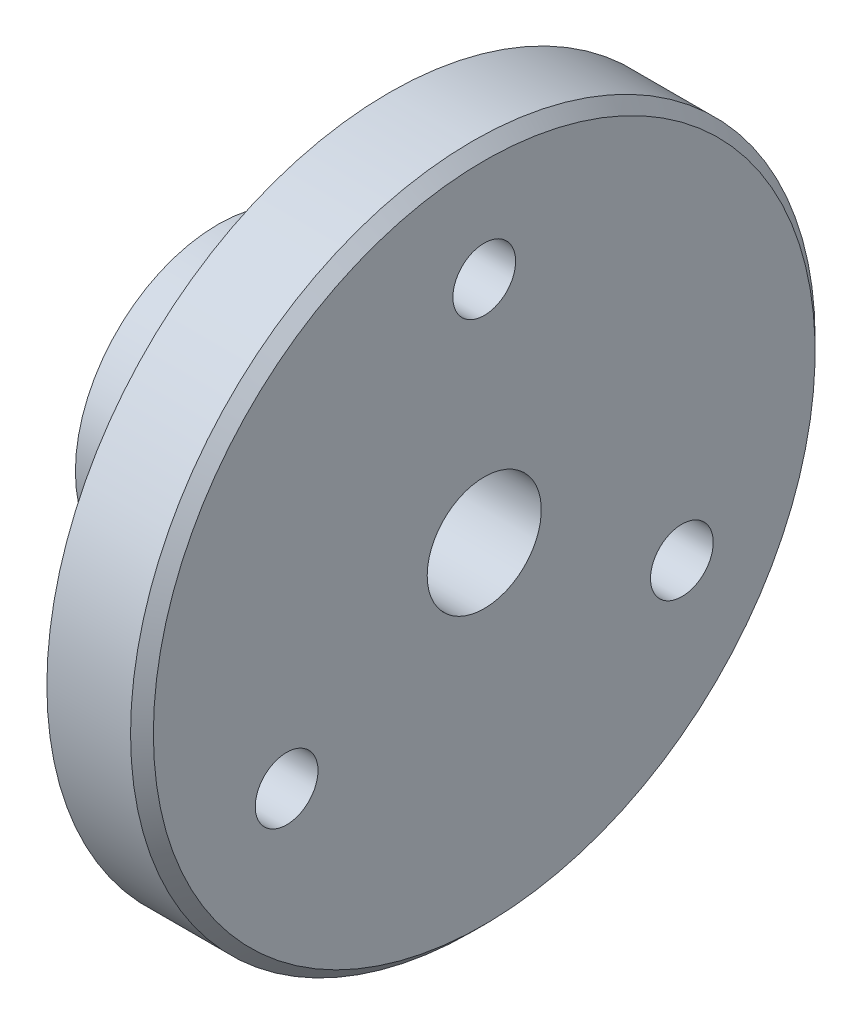
ISO-10303-21;
HEADER;
FILE_DESCRIPTION(('STEP AP214'),'2;1');
FILE_NAME('part.step','',(''),(''),'','','');
FILE_SCHEMA(('AUTOMOTIVE_DESIGN { 1 0 10303 214 1 1 1 1 }'));
ENDSEC;
DATA;
#1=APPLICATION_CONTEXT('core data for automotive mechanical design processes');
#2=APPLICATION_PROTOCOL_DEFINITION('international standard','automotive_design',2000,#1);
#3=PRODUCT_CONTEXT('',#1,'mechanical');
#4=PRODUCT('Part','Part','',(#3));
#5=PRODUCT_RELATED_PRODUCT_CATEGORY('part','',(#4));
#6=PRODUCT_DEFINITION_FORMATION('','',#4);
#7=PRODUCT_DEFINITION_CONTEXT('part definition',#1,'design');
#8=PRODUCT_DEFINITION('design','',#6,#7);
#9=PRODUCT_DEFINITION_SHAPE('','',#8);
#10=(LENGTH_UNIT() NAMED_UNIT(*) SI_UNIT(.MILLI.,.METRE.));
#11=(NAMED_UNIT(*) PLANE_ANGLE_UNIT() SI_UNIT($,.RADIAN.));
#12=(NAMED_UNIT(*) SI_UNIT($,.STERADIAN.) SOLID_ANGLE_UNIT());
#13=UNCERTAINTY_MEASURE_WITH_UNIT(LENGTH_MEASURE(1.E-05),#10,'distance_accuracy_value','');
#14=(GEOMETRIC_REPRESENTATION_CONTEXT(3) GLOBAL_UNCERTAINTY_ASSIGNED_CONTEXT((#13)) GLOBAL_UNIT_ASSIGNED_CONTEXT((#10,
#11,#12)) REPRESENTATION_CONTEXT('',''));
#15=CARTESIAN_POINT('',(0.,0.,0.));
#16=DIRECTION('',(0.,0.,1.));
#17=DIRECTION('',(1.,0.,0.));
#18=AXIS2_PLACEMENT_3D('',#15,#16,#17);
#19=CARTESIAN_POINT('',(0.,3.,0.));
#20=DIRECTION('',(1.,0.,0.));
#21=DIRECTION('',(0.,0.,-1.));
#22=AXIS2_PLACEMENT_3D('',#19,#20,#21);
#23=PLANE('',#22);
#24=CARTESIAN_POINT('',(0.,0.,0.));
#25=DIRECTION('',(-1.,0.,0.));
#26=DIRECTION('',(0.,0.,1.));
#27=AXIS2_PLACEMENT_3D('',#24,#25,#26);
#28=CIRCLE('',#27,3.);
#29=CARTESIAN_POINT('',(0.,0.,3.));
#30=VERTEX_POINT('',#29);
#31=EDGE_CURVE('E87',#30,#30,#28,.T.);
#32=ORIENTED_EDGE('',*,*,#31,.F.);
#33=EDGE_LOOP('',(#32));
#34=FACE_BOUND('',#33,.T.);
#35=CARTESIAN_POINT('',(0.,0.,0.));
#36=DIRECTION('',(-1.,0.,0.));
#37=DIRECTION('',(0.,0.,1.));
#38=AXIS2_PLACEMENT_3D('',#35,#36,#37);
#39=CIRCLE('',#38,7.5);
#40=CARTESIAN_POINT('',(0.,0.,7.5));
#41=VERTEX_POINT('',#40);
#42=EDGE_CURVE('E51',#41,#41,#39,.T.);
#43=ORIENTED_EDGE('',*,*,#42,.T.);
#44=EDGE_LOOP('',(#43));
#45=FACE_BOUND('',#44,.T.);
#46=ADVANCED_FACE('F39',(#34,#45),#23,.F.);
#47=CARTESIAN_POINT('',(0.,0.,0.));
#48=DIRECTION('',(-1.,0.,0.));
#49=DIRECTION('',(0.,0.,1.));
#50=AXIS2_PLACEMENT_3D('',#47,#48,#49);
#51=CYLINDRICAL_SURFACE('',#50,7.5);
#52=CARTESIAN_POINT('',(7.25,0.,-7.5));
#53=CARTESIAN_POINT('',(7.24999720552609,0.0696954524791073,-7.49999880584412));
#54=CARTESIAN_POINT('',(7.24415136251554,0.13942894091941,-7.49901838956517));
#55=CARTESIAN_POINT('',(7.22093217061734,0.276940110836521,-7.49520172470694));
#56=CARTESIAN_POINT('',(7.2035482215442,0.344715933979623,-7.49236376961945));
#57=CARTESIAN_POINT('',(7.15779227570362,0.476302373606322,-7.48515034118225));
#58=CARTESIAN_POINT('',(7.12942926717971,0.54011618421595,-7.48077612579596));
#59=CARTESIAN_POINT('',(7.0625438539738,0.662070920988972,-7.47097113541035));
#60=CARTESIAN_POINT('',(7.0240226112585,0.720212494939295,-7.46554048127217));
#61=CARTESIAN_POINT('',(6.93752245808977,0.82973630714584,-7.45416658729156));
#62=CARTESIAN_POINT('',(6.88946544268193,0.881056451767483,-7.44821935907428));
#63=CARTESIAN_POINT('',(6.78542601576359,0.974944249329963,-7.43651313438366));
#64=CARTESIAN_POINT('',(6.72944310427169,1.01751134969549,-7.43075414981334));
#65=CARTESIAN_POINT('',(6.61071451690147,1.09293356280257,-7.4200378287989));
#66=CARTESIAN_POINT('',(6.54792933159762,1.1257272764305,-7.41508564545818));
#67=CARTESIAN_POINT('',(6.41764521784968,1.18027918270561,-7.40659894897337));
#68=CARTESIAN_POINT('',(6.35014660816118,1.20203812078281,-7.40306434007154));
#69=CARTESIAN_POINT('',(6.21300986257173,1.2337071888924,-7.39785268421378));
#70=CARTESIAN_POINT('',(6.1433971317493,1.2437245145677,-7.3961588424285));
#71=CARTESIAN_POINT('',(6.00345986155826,1.25195836264494,-7.39476969468325));
#72=CARTESIAN_POINT('',(5.93313537291635,1.2501757201945,-7.39507424728607));
#73=CARTESIAN_POINT('',(5.79453606936227,1.23494754919808,-7.39763214431777));
#74=CARTESIAN_POINT('',(5.72624759822738,1.22162244094489,-7.39986536659458));
#75=CARTESIAN_POINT('',(5.59288934108543,1.18387657020172,-7.40599747605504));
#76=CARTESIAN_POINT('',(5.52781966555573,1.15945542715987,-7.40989642036636));
#77=CARTESIAN_POINT('',(5.40238558827954,1.10008862304696,-7.4189423966705));
#78=CARTESIAN_POINT('',(5.34204529695938,1.06509295693986,-7.42409533553663));
#79=CARTESIAN_POINT('',(5.22804779973081,0.985606008778716,-7.43506459207504));
#80=CARTESIAN_POINT('',(5.17439113377253,0.941113960327143,-7.44088096327143));
#81=CARTESIAN_POINT('',(5.07458695709633,0.843241106079526,-7.45261013939893));
#82=CARTESIAN_POINT('',(5.02854074072996,0.789756981936563,-7.45852324615826));
#83=CARTESIAN_POINT('',(4.94606111866733,0.675767624490823,-7.46971300698362));
#84=CARTESIAN_POINT('',(4.90962777490839,0.61526234595321,-7.47498965694873));
#85=CARTESIAN_POINT('',(4.84739888643186,0.488852958083355,-7.48431946446456));
#86=CARTESIAN_POINT('',(4.82161229033437,0.42294436278233,-7.48837159203724));
#87=CARTESIAN_POINT('',(4.78150289237701,0.287649172801366,-7.4947875150633));
#88=CARTESIAN_POINT('',(4.76717913151314,0.218262869589734,-7.49715145175237));
#89=CARTESIAN_POINT('',(4.75053932076943,0.0788549506508117,-7.49990564921343));
#90=CARTESIAN_POINT('',(4.7480842140972,0.00885036857550539,-7.50031876506392));
#91=CARTESIAN_POINT('',(4.75488067221406,-0.130569886444944,-7.49918737210585));
#92=CARTESIAN_POINT('',(4.76413178656687,-0.199985581946019,-7.49764293862059));
#93=CARTESIAN_POINT('',(4.79396242466774,-0.335828087773381,-7.49278413469101));
#94=CARTESIAN_POINT('',(4.81447310419506,-0.402270434192689,-7.48948052400655));
#95=CARTESIAN_POINT('',(4.86616725909977,-0.530773442430221,-7.48147232227679));
#96=CARTESIAN_POINT('',(4.89735133381764,-0.592833857954859,-7.4767676525601));
#97=CARTESIAN_POINT('',(4.96982556234839,-0.711415344734479,-7.46642258151204));
#98=CARTESIAN_POINT('',(5.01120257808363,-0.767882625468574,-7.46077427943511));
#99=CARTESIAN_POINT('',(5.10276865769253,-0.873121792751344,-7.4491923369595));
#100=CARTESIAN_POINT('',(5.15295836163833,-0.921893119848291,-7.44325867585773));
#101=CARTESIAN_POINT('',(5.26134877403571,-1.010871389829,-7.43170087617923));
#102=CARTESIAN_POINT('',(5.3196270827572,-1.05098438055686,-7.42608058068553));
#103=CARTESIAN_POINT('',(5.44217648456927,-1.12085115514749,-7.41585764888942));
#104=CARTESIAN_POINT('',(5.50644738761375,-1.15060526738491,-7.4112549803301));
#105=CARTESIAN_POINT('',(5.63889486640606,-1.19876916573657,-7.40361726848852));
#106=CARTESIAN_POINT('',(5.70705404751524,-1.21722571627397,-7.40057577155532));
#107=CARTESIAN_POINT('',(5.84556006461088,-1.24241772688914,-7.3963885841763));
#108=CARTESIAN_POINT('',(5.91590670986603,-1.24915420597308,-7.39524272891361));
#109=CARTESIAN_POINT('',(6.0558525829812,-1.25068643302368,-7.39498366542006));
#110=CARTESIAN_POINT('',(6.12545018928764,-1.24563006806259,-7.39584528252825));
#111=CARTESIAN_POINT('',(6.26278962402538,-1.22403991947842,-7.39944890726864));
#112=CARTESIAN_POINT('',(6.33053145847093,-1.20750617305624,-7.40219090880607));
#113=CARTESIAN_POINT('',(6.46217921864631,-1.16348724479745,-7.40923678140859));
#114=CARTESIAN_POINT('',(6.52608950502801,-1.13601479530022,-7.41353883609835));
#115=CARTESIAN_POINT('',(6.64841783459742,-1.07091350195795,-7.42322184461104));
#116=CARTESIAN_POINT('',(6.70683560518607,-1.03328415437428,-7.428602851942));
#117=CARTESIAN_POINT('',(6.81726779155388,-0.948409442186077,-7.43991727022811));
#118=CARTESIAN_POINT('',(6.86919800835013,-0.901055281796823,-7.44585647788151));
#119=CARTESIAN_POINT('',(6.96442580223747,-0.798304515690115,-7.4575718618042));
#120=CARTESIAN_POINT('',(7.00772138431908,-0.742906056456318,-7.46334800013273));
#121=CARTESIAN_POINT('',(7.08472413409997,-0.625184584820141,-7.4741326482111));
#122=CARTESIAN_POINT('',(7.11836301965647,-0.562816393766409,-7.47913558126552));
#123=CARTESIAN_POINT('',(7.17463474230496,-0.433256534689491,-7.48775583800888));
#124=CARTESIAN_POINT('',(7.19727854053985,-0.366069747415005,-7.49137454088741));
#125=CARTESIAN_POINT('',(7.22600263706333,-0.2488516550227,-7.49602895416478));
#126=CARTESIAN_POINT('',(7.23498723480798,-0.199529415149224,-7.49751013636679));
#127=CARTESIAN_POINT('',(7.24698686892237,-0.100144655159904,-7.4994960799306));
#128=CARTESIAN_POINT('',(7.25000200806868,-0.0500821478042471,-7.50000085810321));
#129=CARTESIAN_POINT('',(7.25,0.,-7.5));
#130=B_SPLINE_CURVE_WITH_KNOTS('',3,(#52,#53,#54,#55,#56,#57,#58,#59,#60,#61,#62,#63,#64,#65,
#66,#67,#68,#69,#70,#71,#72,#73,#74,#75,#76,#77,#78,#79,#80,#81,#82,#83,#84,#85,#86,#87,#88,#89,
#90,#91,#92,#93,#94,#95,#96,#97,#98,#99,#100,#101,#102,#103,#104,#105,#106,#107,#108,#109,#110,
#111,#112,#113,#114,#115,#116,#117,#118,#119,#120,#121,#122,#123,#124,#125,#126,#127,#128,#129),
.UNSPECIFIED.,.T.,.F.,(4,2,2,2,2,2,2,2,2,2,2,2,2,2,2,2,2,2,2,2,2,2,2,2,2,2,2,2,2,2,2,2,2,2,2,2,
2,2,4),(0.,0.208903292469255,0.41799877284771,0.626923433512635,0.835824206337395,
1.04651245531166,1.25721400084928,1.4692126041192,1.68119688438091,1.89123038551712,
2.10124902160443,2.30910260880204,2.5169633251269,2.72582278316279,2.93469910340287,
3.14616384955663,3.35762995817924,3.56927344457951,3.78089922260574,3.99003941745698,
4.1991715651793,4.40703903503208,4.61491817913033,4.82463412813512,5.03436531527141,
5.24626911003809,5.45816618687971,5.66918011170886,5.88017568893309,6.0885395476135,
6.29690273094066,6.50502409113111,6.71315577514668,6.92375692096696,7.13440666939486,
7.34651115803599,7.55840376065035,7.70852124082009,7.85863613638483),.UNSPECIFIED.);
#131=CARTESIAN_POINT('',(7.25,0.,-7.5));
#132=VERTEX_POINT('',#131);
#133=EDGE_CURVE('E65',#132,#132,#130,.T.);
#134=ORIENTED_EDGE('',*,*,#133,.T.);
#135=EDGE_LOOP('',(#134));
#136=FACE_BOUND('',#135,.T.);
#137=ORIENTED_EDGE('',*,*,#42,.F.);
#138=EDGE_LOOP('',(#137));
#139=FACE_BOUND('',#138,.T.);
#140=CARTESIAN_POINT('',(9.,0.,0.));
#141=DIRECTION('',(-1.,0.,0.));
#142=DIRECTION('',(0.,0.,1.));
#143=AXIS2_PLACEMENT_3D('',#140,#141,#142);
#144=CIRCLE('',#143,7.5);
#145=CARTESIAN_POINT('',(9.,0.,7.5));
#146=VERTEX_POINT('',#145);
#147=EDGE_CURVE('E55',#146,#146,#144,.T.);
#148=ORIENTED_EDGE('',*,*,#147,.T.);
#149=EDGE_LOOP('',(#148));
#150=FACE_BOUND('',#149,.T.);
#151=ADVANCED_FACE('F90',(#136,#139,#150),#51,.T.);
#152=CARTESIAN_POINT('',(9.,18.,0.));
#153=DIRECTION('',(1.,0.,0.));
#154=DIRECTION('',(0.,0.,-1.));
#155=AXIS2_PLACEMENT_3D('',#152,#153,#154);
#156=PLANE('',#155);
#157=CARTESIAN_POINT('',(9.,-5.9999999999999,10.3923048454133));
#158=DIRECTION('',(1.,0.,0.));
#159=DIRECTION('',(0.,0.,-1.));
#160=AXIS2_PLACEMENT_3D('',#157,#158,#159);
#161=CIRCLE('',#160,1.65);
#162=CARTESIAN_POINT('',(9.,-5.9999999999999,8.74230484541332));
#163=VERTEX_POINT('',#162);
#164=EDGE_CURVE('E151',#163,#163,#161,.T.);
#165=ORIENTED_EDGE('',*,*,#164,.T.);
#166=EDGE_LOOP('',(#165));
#167=FACE_BOUND('',#166,.T.);
#168=CARTESIAN_POINT('',(9.,-6.00000000000005,-10.3923048454132));
#169=DIRECTION('',(1.,0.,0.));
#170=DIRECTION('',(0.,0.,-1.));
#171=AXIS2_PLACEMENT_3D('',#168,#169,#170);
#172=CIRCLE('',#171,1.65);
#173=CARTESIAN_POINT('',(9.,-6.00000000000005,-12.0423048454132));
#174=VERTEX_POINT('',#173);
#175=EDGE_CURVE('E145',#174,#174,#172,.T.);
#176=ORIENTED_EDGE('',*,*,#175,.T.);
#177=EDGE_LOOP('',(#176));
#178=FACE_BOUND('',#177,.T.);
#179=CARTESIAN_POINT('',(9.,12.,0.));
#180=DIRECTION('',(1.,0.,0.));
#181=DIRECTION('',(0.,0.,-1.));
#182=AXIS2_PLACEMENT_3D('',#179,#180,#181);
#183=CIRCLE('',#182,1.65);
#184=CARTESIAN_POINT('',(9.,12.,-1.65));
#185=VERTEX_POINT('',#184);
#186=EDGE_CURVE('E66',#185,#185,#183,.T.);
#187=ORIENTED_EDGE('',*,*,#186,.T.);
#188=EDGE_LOOP('',(#187));
#189=FACE_BOUND('',#188,.T.);
#190=ORIENTED_EDGE('',*,*,#147,.F.);
#191=EDGE_LOOP('',(#190));
#192=FACE_BOUND('',#191,.T.);
#193=CARTESIAN_POINT('',(9.,0.,0.));
#194=DIRECTION('',(-1.,0.,0.));
#195=DIRECTION('',(0.,0.,1.));
#196=AXIS2_PLACEMENT_3D('',#193,#194,#195);
#197=CIRCLE('',#196,18.);
#198=CARTESIAN_POINT('',(9.,0.,18.));
#199=VERTEX_POINT('',#198);
#200=EDGE_CURVE('E110',#199,#199,#197,.T.);
#201=ORIENTED_EDGE('',*,*,#200,.T.);
#202=EDGE_LOOP('',(#201));
#203=FACE_BOUND('',#202,.T.);
#204=ADVANCED_FACE('F94',(#167,#178,#189,#192,#203),#156,.F.);
#205=CARTESIAN_POINT('',(0.,0.,0.));
#206=DIRECTION('',(-1.,0.,0.));
#207=DIRECTION('',(0.,0.,1.));
#208=AXIS2_PLACEMENT_3D('',#205,#206,#207);
#209=CYLINDRICAL_SURFACE('',#208,18.);
#210=CARTESIAN_POINT('',(13.4,0.,0.));
#211=DIRECTION('',(-1.,0.,0.));
#212=DIRECTION('',(0.,0.,1.));
#213=AXIS2_PLACEMENT_3D('',#210,#211,#212);
#214=CIRCLE('',#213,18.);
#215=CARTESIAN_POINT('',(13.4,0.,18.));
#216=VERTEX_POINT('',#215);
#217=EDGE_CURVE('E47',#216,#216,#214,.T.);
#218=ORIENTED_EDGE('',*,*,#217,.T.);
#219=EDGE_LOOP('',(#218));
#220=FACE_BOUND('',#219,.T.);
#221=ORIENTED_EDGE('',*,*,#200,.F.);
#222=EDGE_LOOP('',(#221));
#223=FACE_BOUND('',#222,.T.);
#224=ADVANCED_FACE('F124',(#220,#223),#209,.T.);
#225=CARTESIAN_POINT('',(14.,3.,0.));
#226=DIRECTION('',(-1.,0.,0.));
#227=DIRECTION('',(0.,0.,1.));
#228=AXIS2_PLACEMENT_3D('',#225,#226,#227);
#229=PLANE('',#228);
#230=CARTESIAN_POINT('',(14.,0.,0.));
#231=DIRECTION('',(-1.,0.,0.));
#232=DIRECTION('',(0.,0.,1.));
#233=AXIS2_PLACEMENT_3D('',#230,#231,#232);
#234=CIRCLE('',#233,17.4);
#235=CARTESIAN_POINT('',(14.,0.,17.4));
#236=VERTEX_POINT('',#235);
#237=EDGE_CURVE('E10',#236,#236,#234,.F.);
#238=ORIENTED_EDGE('',*,*,#237,.T.);
#239=EDGE_LOOP('',(#238));
#240=FACE_BOUND('',#239,.T.);
#241=CARTESIAN_POINT('',(14.,-5.9999999999999,10.3923048454133));
#242=DIRECTION('',(1.,0.,0.));
#243=DIRECTION('',(0.,0.,-1.));
#244=AXIS2_PLACEMENT_3D('',#241,#242,#243);
#245=CIRCLE('',#244,1.65);
#246=CARTESIAN_POINT('',(14.,-5.9999999999999,8.74230484541332));
#247=VERTEX_POINT('',#246);
#248=EDGE_CURVE('E136',#247,#247,#245,.T.);
#249=ORIENTED_EDGE('',*,*,#248,.F.);
#250=EDGE_LOOP('',(#249));
#251=FACE_BOUND('',#250,.T.);
#252=CARTESIAN_POINT('',(14.,-6.00000000000005,-10.3923048454132));
#253=DIRECTION('',(1.,0.,0.));
#254=DIRECTION('',(0.,0.,-1.));
#255=AXIS2_PLACEMENT_3D('',#252,#253,#254);
#256=CIRCLE('',#255,1.65);
#257=CARTESIAN_POINT('',(14.,-6.00000000000005,-12.0423048454132));
#258=VERTEX_POINT('',#257);
#259=EDGE_CURVE('E140',#258,#258,#256,.T.);
#260=ORIENTED_EDGE('',*,*,#259,.F.);
#261=EDGE_LOOP('',(#260));
#262=FACE_BOUND('',#261,.T.);
#263=CARTESIAN_POINT('',(14.,12.,0.));
#264=DIRECTION('',(1.,0.,0.));
#265=DIRECTION('',(0.,0.,-1.));
#266=AXIS2_PLACEMENT_3D('',#263,#264,#265);
#267=CIRCLE('',#266,1.65);
#268=CARTESIAN_POINT('',(14.,12.,-1.65));
#269=VERTEX_POINT('',#268);
#270=EDGE_CURVE('E143',#269,#269,#267,.T.);
#271=ORIENTED_EDGE('',*,*,#270,.F.);
#272=EDGE_LOOP('',(#271));
#273=FACE_BOUND('',#272,.T.);
#274=CARTESIAN_POINT('',(14.,0.,0.));
#275=DIRECTION('',(-1.,0.,0.));
#276=DIRECTION('',(0.,0.,1.));
#277=AXIS2_PLACEMENT_3D('',#274,#275,#276);
#278=CIRCLE('',#277,3.);
#279=CARTESIAN_POINT('',(14.,0.,3.));
#280=VERTEX_POINT('',#279);
#281=EDGE_CURVE('E112',#280,#280,#278,.T.);
#282=ORIENTED_EDGE('',*,*,#281,.T.);
#283=EDGE_LOOP('',(#282));
#284=FACE_BOUND('',#283,.T.);
#285=ADVANCED_FACE('F119',(#240,#251,#262,#273,#284),#229,.F.);
#286=CARTESIAN_POINT('',(0.,0.,0.));
#287=DIRECTION('',(-1.,0.,0.));
#288=DIRECTION('',(0.,0.,1.));
#289=AXIS2_PLACEMENT_3D('',#286,#287,#288);
#290=CYLINDRICAL_SURFACE('',#289,3.);
#291=CARTESIAN_POINT('',(7.25,0.,-3.));
#292=CARTESIAN_POINT('',(7.2499927949087,-0.0669580526362669,-2.99999458367273));
#293=CARTESIAN_POINT('',(7.24458804147186,-0.134021397063841,-2.9977323297471));
#294=CARTESIAN_POINT('',(7.22316093507982,-0.266247371156347,-2.98890153579552));
#295=CARTESIAN_POINT('',(7.20711087553575,-0.331404576423564,-2.98232175901028));
#296=CARTESIAN_POINT('',(7.16508890821941,-0.457688733653088,-2.96556289038127));
#297=CARTESIAN_POINT('',(7.13915061053185,-0.518828524426269,-2.95539599975004));
#298=CARTESIAN_POINT('',(7.07822717676743,-0.635829756679802,-2.93245286470664));
#299=CARTESIAN_POINT('',(7.04324478102913,-0.691692790015939,-2.91967741092849));
#300=CARTESIAN_POINT('',(6.96337101740912,-0.799448403559512,-2.89207828351869));
#301=CARTESIAN_POINT('',(6.91809869121025,-0.851041267517769,-2.87718753326093));
#302=CARTESIAN_POINT('',(6.81973566521743,-0.946159821091263,-2.84732714068513));
#303=CARTESIAN_POINT('',(6.76664087510549,-0.989681263153086,-2.83235746106809));
#304=CARTESIAN_POINT('',(6.6509732224351,-1.06953737697065,-2.80321021812995));
#305=CARTESIAN_POINT('',(6.58806255157346,-1.10541308153925,-2.78910786873385));
#306=CARTESIAN_POINT('',(6.45642674207907,-1.16593940588866,-2.76435572357005));
#307=CARTESIAN_POINT('',(6.38770462051555,-1.19059580836291,-2.75370415000823));
#308=CARTESIAN_POINT('',(6.24984630823208,-1.22674598312159,-2.73778555387705));
#309=CARTESIAN_POINT('',(6.18088951660785,-1.23881657877606,-2.73228387651787));
#310=CARTESIAN_POINT('',(6.04172670731343,-1.25125209967796,-2.72661326219504));
#311=CARTESIAN_POINT('',(5.97152139997426,-1.25162348054397,-2.7264413842526));
#312=CARTESIAN_POINT('',(5.83759993956506,-1.24108450363674,-2.73125119560853));
#313=CARTESIAN_POINT('',(5.77379890343554,-1.23103681112301,-2.73583882723623));
#314=CARTESIAN_POINT('',(5.64888790899961,-1.20139191015777,-2.74898482773796));
#315=CARTESIAN_POINT('',(5.58777846850823,-1.18179287287177,-2.75754395703564));
#316=CARTESIAN_POINT('',(5.46844229700856,-1.13321958727571,-2.77786184772756));
#317=CARTESIAN_POINT('',(5.41030457908662,-1.10405471539236,-2.78968481949136));
#318=CARTESIAN_POINT('',(5.29952226611985,-1.03731242580562,-2.81518331141086));
#319=CARTESIAN_POINT('',(5.24687984938648,-0.999731690519545,-2.82885956129779));
#320=CARTESIAN_POINT('',(5.14390004126716,-0.913495965543836,-2.85792976877979));
#321=CARTESIAN_POINT('',(5.09413343261456,-0.864173483207527,-2.87337121404473));
#322=CARTESIAN_POINT('',(5.00338649704082,-0.757729591051512,-2.90325673112529));
#323=CARTESIAN_POINT('',(4.96240822830782,-0.700606359448457,-2.9177005687701));
#324=CARTESIAN_POINT('',(4.88956417638373,-0.578447948693377,-2.94438283556473));
#325=CARTESIAN_POINT('',(4.85793055484932,-0.513260582447681,-2.95656266543334));
#326=CARTESIAN_POINT('',(4.80627886039674,-0.377852402526833,-2.97689481414803));
#327=CARTESIAN_POINT('',(4.78625436805618,-0.307634394795036,-2.985049358458));
#328=CARTESIAN_POINT('',(4.75958400787336,-0.16892811334623,-2.99599641186385));
#329=CARTESIAN_POINT('',(4.75217214255625,-0.100611285278641,-2.99909541047125));
#330=CARTESIAN_POINT('',(4.7486537763859,0.0363546554960876,-3.00056050368745));
#331=CARTESIAN_POINT('',(4.752544029748,0.105003667152634,-2.99892795711939));
#332=CARTESIAN_POINT('',(4.77097108480607,0.237098242341434,-2.9913121765694));
#333=CARTESIAN_POINT('',(4.7849699540972,0.300632966639385,-2.9855488728399));
#334=CARTESIAN_POINT('',(4.82246819454078,0.424382748971089,-2.97048606772414));
#335=CARTESIAN_POINT('',(4.8459687659503,0.48459738651836,-2.96118611959704));
#336=CARTESIAN_POINT('',(4.90257097571211,0.602108999869135,-2.93958270645166));
#337=CARTESIAN_POINT('',(4.93594818314603,0.659257236855323,-2.92719491469281));
#338=CARTESIAN_POINT('',(5.01105337779169,0.767346216231428,-2.9007380457909));
#339=CARTESIAN_POINT('',(5.05278485152927,0.81828435260194,-2.88666826768733));
#340=CARTESIAN_POINT('',(5.1469032332724,0.916333430274263,-2.85712087895438));
#341=CARTESIAN_POINT('',(5.19983850298626,0.962910697979835,-2.84161451591029));
#342=CARTESIAN_POINT('',(5.31302127593539,1.04666984610551,-2.81184336768005));
#343=CARTESIAN_POINT('',(5.37327043517173,1.08384959285617,-2.79757886493438));
#344=CARTESIAN_POINT('',(5.50061417530257,1.14815960208699,-2.77181386243988));
#345=CARTESIAN_POINT('',(5.56779403551483,1.17513918237329,-2.76035562555111));
#346=CARTESIAN_POINT('',(5.7063705938101,1.21717413951573,-2.74208355658957));
#347=CARTESIAN_POINT('',(5.77776376248335,1.23223934863688,-2.73526589555752));
#348=CARTESIAN_POINT('',(5.91681869919921,1.24904080348901,-2.72763164537264));
#349=CARTESIAN_POINT('',(5.98434466229261,1.25171380413129,-2.72639350967163));
#350=CARTESIAN_POINT('',(6.1188428611411,1.24615575523912,-2.72893853011024));
#351=CARTESIAN_POINT('',(6.18581518031369,1.23792637964722,-2.73272091540306));
#352=CARTESIAN_POINT('',(6.31409274746889,1.21158404780491,-2.74449551302268));
#353=CARTESIAN_POINT('',(6.37551667346339,1.19394903571466,-2.7522835484648));
#354=CARTESIAN_POINT('',(6.49454802135722,1.14976328202135,-2.77103181199189));
#355=CARTESIAN_POINT('',(6.55215436539878,1.12321003517252,-2.78199293131693));
#356=CARTESIAN_POINT('',(6.66569589594912,1.0601028593549,-2.80666954560013));
#357=CARTESIAN_POINT('',(6.72132233016829,1.02304360910483,-2.82051102713679));
#358=CARTESIAN_POINT('',(6.82586013936068,0.940684072630392,-2.84903689053839));
#359=CARTESIAN_POINT('',(6.87476917560057,0.89538092890562,-2.86372156345875));
#360=CARTESIAN_POINT('',(6.96814868168474,0.793902045778822,-2.89356392850106));
#361=CARTESIAN_POINT('',(7.01203643284065,0.737174739949029,-2.90867817511791));
#362=CARTESIAN_POINT('',(7.08969945354362,0.6166000792532,-2.9366014362202));
#363=CARTESIAN_POINT('',(7.12347011488955,0.552749497945747,-2.9494093991674));
#364=CARTESIAN_POINT('',(7.17920984543988,0.420732056717951,-2.97109183362461));
#365=CARTESIAN_POINT('',(7.2013647666173,0.352653990980636,-2.98002782581964));
#366=CARTESIAN_POINT('',(7.23370632907783,0.213410421846559,-2.99321009768625));
#367=CARTESIAN_POINT('',(7.24393044252988,0.142255316980958,-2.99747105811967));
#368=CARTESIAN_POINT('',(7.24933316108645,0.0472360819191838,-2.99972287568934));
#369=CARTESIAN_POINT('',(7.25000254214922,0.0236245946756574,-3.00000191102536));
#370=CARTESIAN_POINT('',(7.25,0.,-3.));
#371=B_SPLINE_CURVE_WITH_KNOTS('',3,(#291,#292,#293,#294,#295,#296,#297,#298,#299,#300,#301,
#302,#303,#304,#305,#306,#307,#308,#309,#310,#311,#312,#313,#314,#315,#316,#317,#318,#319,#320,
#321,#322,#323,#324,#325,#326,#327,#328,#329,#330,#331,#332,#333,#334,#335,#336,#337,#338,#339,
#340,#341,#342,#343,#344,#345,#346,#347,#348,#349,#350,#351,#352,#353,#354,#355,#356,#357,#358,
#359,#360,#361,#362,#363,#364,#365,#366,#367,#368,#369,#370),.UNSPECIFIED.,.T.,.F.,(4,2,2,2,2,2,
2,2,2,2,2,2,2,2,2,2,2,2,2,2,2,2,2,2,2,2,2,2,2,2,2,2,2,2,2,2,2,2,2,4),(0.,0.200806918883939,
0.402138540628696,0.602791851906301,0.803384436852975,1.01317936288807,1.22308438131465,
1.44331724539125,1.66343646730588,1.87295273137557,2.08235338249046,2.27570157202556,
2.46908679727212,2.66658713058714,2.86416545717206,3.07844141127897,3.29276749314588,
3.51204055060813,3.73119224218297,3.93648443393251,4.14171767493172,4.33676589735721,
4.53183876601785,4.73297135272161,4.93418805469496,5.14978488029294,5.36543061240341,
5.58414788359524,5.80268447074581,6.00439877559644,6.20608211297537,6.39837649964763,
6.59072494950613,6.79463893397441,6.99862373425944,7.21746535004889,7.43640649428582,
7.65172855819385,7.86637250469321,7.93722256499098),.UNSPECIFIED.);
#372=CARTESIAN_POINT('',(7.25,0.,-3.));
#373=VERTEX_POINT('',#372);
#374=EDGE_CURVE('E58',#373,#373,#371,.T.);
#375=ORIENTED_EDGE('',*,*,#374,.T.);
#376=EDGE_LOOP('',(#375));
#377=FACE_BOUND('',#376,.T.);
#378=ORIENTED_EDGE('',*,*,#281,.F.);
#379=EDGE_LOOP('',(#378));
#380=FACE_BOUND('',#379,.T.);
#381=ORIENTED_EDGE('',*,*,#31,.T.);
#382=EDGE_LOOP('',(#381));
#383=FACE_BOUND('',#382,.T.);
#384=ADVANCED_FACE('F68',(#377,#380,#383),#290,.F.);
#385=CARTESIAN_POINT('',(6.,0.,-18.));
#386=DIRECTION('',(0.,0.,1.));
#387=DIRECTION('',(1.,0.,0.));
#388=AXIS2_PLACEMENT_3D('',#385,#386,#387);
#389=CYLINDRICAL_SURFACE('',#388,1.25);
#390=ORIENTED_EDGE('',*,*,#374,.F.);
#391=EDGE_LOOP('',(#390));
#392=FACE_BOUND('',#391,.T.);
#393=ORIENTED_EDGE('',*,*,#133,.F.);
#394=EDGE_LOOP('',(#393));
#395=FACE_BOUND('',#394,.T.);
#396=ADVANCED_FACE('F71',(#392,#395),#389,.F.);
#397=CARTESIAN_POINT('',(14.,12.,0.));
#398=DIRECTION('',(1.,0.,0.));
#399=DIRECTION('',(0.,0.,-1.));
#400=AXIS2_PLACEMENT_3D('',#397,#398,#399);
#401=CYLINDRICAL_SURFACE('',#400,1.65);
#402=ORIENTED_EDGE('',*,*,#270,.T.);
#403=EDGE_LOOP('',(#402));
#404=FACE_BOUND('',#403,.T.);
#405=ORIENTED_EDGE('',*,*,#186,.F.);
#406=EDGE_LOOP('',(#405));
#407=FACE_BOUND('',#406,.T.);
#408=ADVANCED_FACE('F75',(#404,#407),#401,.F.);
#409=CARTESIAN_POINT('',(14.,-6.00000000000005,-10.3923048454132));
#410=DIRECTION('',(1.,0.,0.));
#411=DIRECTION('',(0.,0.,-1.));
#412=AXIS2_PLACEMENT_3D('',#409,#410,#411);
#413=CYLINDRICAL_SURFACE('',#412,1.65);
#414=ORIENTED_EDGE('',*,*,#259,.T.);
#415=EDGE_LOOP('',(#414));
#416=FACE_BOUND('',#415,.T.);
#417=ORIENTED_EDGE('',*,*,#175,.F.);
#418=EDGE_LOOP('',(#417));
#419=FACE_BOUND('',#418,.T.);
#420=ADVANCED_FACE('F158',(#416,#419),#413,.F.);
#421=CARTESIAN_POINT('',(14.,-5.9999999999999,10.3923048454133));
#422=DIRECTION('',(1.,0.,0.));
#423=DIRECTION('',(0.,0.,-1.));
#424=AXIS2_PLACEMENT_3D('',#421,#422,#423);
#425=CYLINDRICAL_SURFACE('',#424,1.65);
#426=ORIENTED_EDGE('',*,*,#248,.T.);
#427=EDGE_LOOP('',(#426));
#428=FACE_BOUND('',#427,.T.);
#429=ORIENTED_EDGE('',*,*,#164,.F.);
#430=EDGE_LOOP('',(#429));
#431=FACE_BOUND('',#430,.T.);
#432=ADVANCED_FACE('F155',(#428,#431),#425,.F.);
#433=CARTESIAN_POINT('',(13.4,0.,0.));
#434=DIRECTION('',(-1.,0.,0.));
#435=DIRECTION('',(0.,0.,1.));
#436=AXIS2_PLACEMENT_3D('',#433,#434,#435);
#437=CONICAL_SURFACE('',#436,18.,0.785398163397451);
#438=ORIENTED_EDGE('',*,*,#237,.F.);
#439=EDGE_LOOP('',(#438));
#440=FACE_BOUND('',#439,.T.);
#441=ORIENTED_EDGE('',*,*,#217,.F.);
#442=EDGE_LOOP('',(#441));
#443=FACE_BOUND('',#442,.T.);
#444=ADVANCED_FACE('F42',(#440,#443),#437,.T.);
#445=CLOSED_SHELL('',(#46,#151,#204,#224,#285,#384,#396,#408,#420,#432,#444));
#446=MANIFOLD_SOLID_BREP('B2',#445);
#447=ADVANCED_BREP_SHAPE_REPRESENTATION('',(#18,#446),#14);
#448=SHAPE_DEFINITION_REPRESENTATION(#9,#447);
ENDSEC;
END-ISO-10303-21;
